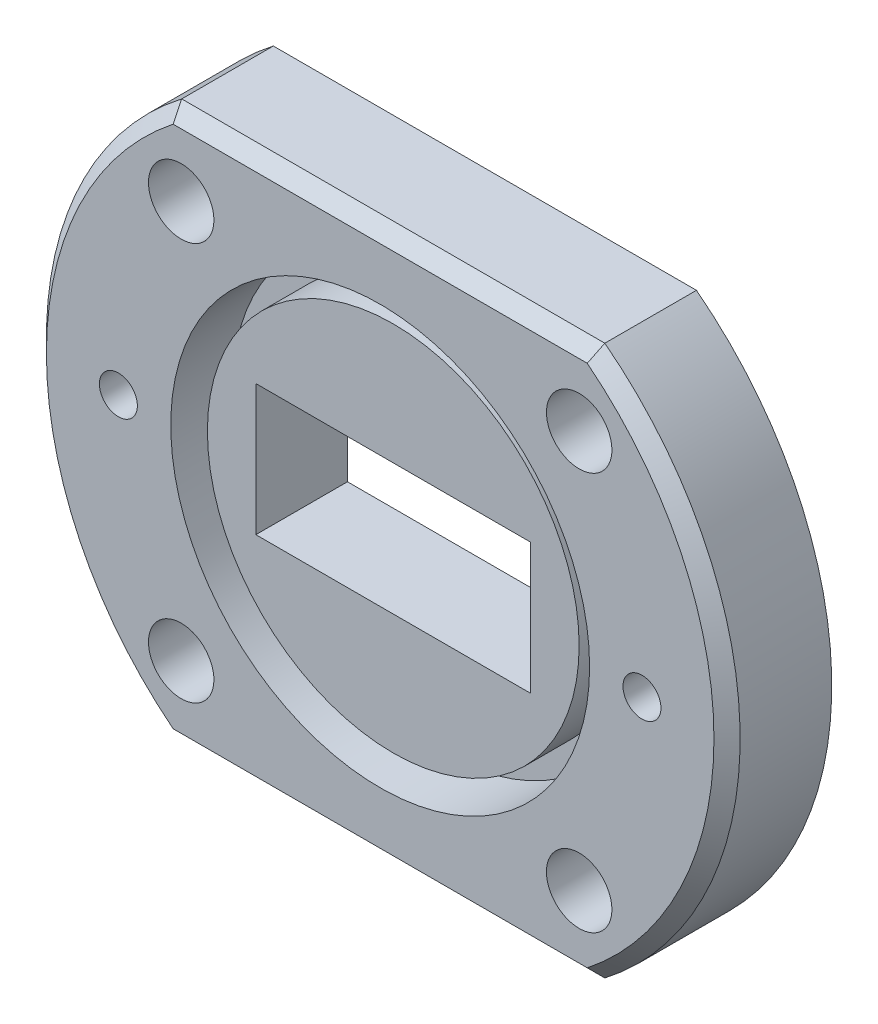
ISO-10303-21;
HEADER;
FILE_DESCRIPTION(('STEP AP214'),'2;1');
FILE_NAME('part.step','',(''),(''),'','','');
FILE_SCHEMA(('AUTOMOTIVE_DESIGN { 1 0 10303 214 1 1 1 1 }'));
ENDSEC;
DATA;
#1=APPLICATION_CONTEXT('core data for automotive mechanical design processes');
#2=APPLICATION_PROTOCOL_DEFINITION('international standard','automotive_design',2000,#1);
#3=PRODUCT_CONTEXT('',#1,'mechanical');
#4=PRODUCT('Part','Part','',(#3));
#5=PRODUCT_RELATED_PRODUCT_CATEGORY('part','',(#4));
#6=PRODUCT_DEFINITION_FORMATION('','',#4);
#7=PRODUCT_DEFINITION_CONTEXT('part definition',#1,'design');
#8=PRODUCT_DEFINITION('design','',#6,#7);
#9=PRODUCT_DEFINITION_SHAPE('','',#8);
#10=(LENGTH_UNIT() NAMED_UNIT(*) SI_UNIT(.MILLI.,.METRE.));
#11=(NAMED_UNIT(*) PLANE_ANGLE_UNIT() SI_UNIT($,.RADIAN.));
#12=(NAMED_UNIT(*) SI_UNIT($,.STERADIAN.) SOLID_ANGLE_UNIT());
#13=UNCERTAINTY_MEASURE_WITH_UNIT(LENGTH_MEASURE(1.E-05),#10,'distance_accuracy_value','');
#14=(GEOMETRIC_REPRESENTATION_CONTEXT(3) GLOBAL_UNCERTAINTY_ASSIGNED_CONTEXT((#13)) GLOBAL_UNIT_ASSIGNED_CONTEXT((#10,
#11,#12)) REPRESENTATION_CONTEXT('',''));
#15=CARTESIAN_POINT('',(0.,0.,0.));
#16=DIRECTION('',(0.,0.,1.));
#17=DIRECTION('',(1.,0.,0.));
#18=AXIS2_PLACEMENT_3D('',#15,#16,#17);
#19=CARTESIAN_POINT('',(0.,0.,8.));
#20=DIRECTION('',(0.,0.,-1.));
#21=DIRECTION('',(-1.,0.,0.));
#22=AXIS2_PLACEMENT_3D('',#19,#20,#21);
#23=CYLINDRICAL_SURFACE('',#22,26.5);
#24=CARTESIAN_POINT('',(0.,0.,7.00000000000001));
#25=DIRECTION('',(0.,0.,1.));
#26=DIRECTION('',(1.,0.,0.));
#27=AXIS2_PLACEMENT_3D('',#24,#25,#26);
#28=CIRCLE('',#27,26.5);
#29=CARTESIAN_POINT('',(16.1632298752446,21.,7.00000000000001));
#30=VERTEX_POINT('',#29);
#31=CARTESIAN_POINT('',(16.1632298752446,-21.,7.00000000000001));
#32=VERTEX_POINT('',#31);
#33=EDGE_CURVE('E148',#30,#32,#28,.F.);
#34=ORIENTED_EDGE('',*,*,#33,.T.);
#35=DIRECTION('',(0.,0.,-1.));
#36=VECTOR('',#35,1.);
#37=CARTESIAN_POINT('',(16.1632298752446,-21.,8.));
#38=LINE('',#37,#36);
#39=CARTESIAN_POINT('',(16.1632298752446,-21.,0.));
#40=VERTEX_POINT('',#39);
#41=EDGE_CURVE('E146',#32,#40,#38,.T.);
#42=ORIENTED_EDGE('',*,*,#41,.T.);
#43=CARTESIAN_POINT('',(0.,0.,0.));
#44=DIRECTION('',(0.,0.,1.));
#45=DIRECTION('',(1.,0.,0.));
#46=AXIS2_PLACEMENT_3D('',#43,#44,#45);
#47=CIRCLE('',#46,26.5);
#48=CARTESIAN_POINT('',(16.1632298752446,21.,0.));
#49=VERTEX_POINT('',#48);
#50=EDGE_CURVE('E210',#40,#49,#47,.T.);
#51=ORIENTED_EDGE('',*,*,#50,.T.);
#52=DIRECTION('',(0.,0.,-1.));
#53=VECTOR('',#52,1.);
#54=CARTESIAN_POINT('',(16.1632298752446,21.,8.));
#55=LINE('',#54,#53);
#56=EDGE_CURVE('E205',#49,#30,#55,.F.);
#57=ORIENTED_EDGE('',*,*,#56,.T.);
#58=EDGE_LOOP('',(#34,#42,#51,#57));
#59=FACE_BOUND('',#58,.T.);
#60=ADVANCED_FACE('F50',(#59),#23,.T.);
#61=CARTESIAN_POINT('',(0.,0.,8.));
#62=DIRECTION('',(0.,0.,-1.));
#63=DIRECTION('',(-1.,0.,0.));
#64=AXIS2_PLACEMENT_3D('',#61,#62,#63);
#65=CONICAL_SURFACE('',#64,25.5,0.785398163397447);
#66=CARTESIAN_POINT('',(0.,0.,8.));
#67=DIRECTION('',(0.,0.,1.));
#68=DIRECTION('',(1.,0.,0.));
#69=AXIS2_PLACEMENT_3D('',#66,#67,#68);
#70=CIRCLE('',#69,25.5);
#71=CARTESIAN_POINT('',(15.8192920195564,-20.,8.));
#72=VERTEX_POINT('',#71);
#73=CARTESIAN_POINT('',(15.8192920195564,20.,8.));
#74=VERTEX_POINT('',#73);
#75=EDGE_CURVE('E166',#72,#74,#70,.T.);
#76=ORIENTED_EDGE('',*,*,#75,.F.);
#77=CARTESIAN_POINT('',(15.8192920195564,-20.,8.));
#78=CARTESIAN_POINT('',(15.8771970048923,-20.166566584311,7.83343341568894));
#79=CARTESIAN_POINT('',(15.934810986366,-20.3331832122443,7.66681678775571));
#80=CARTESIAN_POINT('',(16.0494569382279,-20.6665165455835,7.33348345441651));
#81=CARTESIAN_POINT('',(16.1064889086503,-20.8332332509836,7.16676674901641));
#82=CARTESIAN_POINT('',(16.1632298752446,-21.,7.));
#83=B_SPLINE_CURVE_WITH_KNOTS('',3,(#77,#78,#79,#80,#81,#82),.UNSPECIFIED.,.F.,.F.,(4,2,4),(0.,
0.727718455462264,1.45543686825852),.UNSPECIFIED.);
#84=EDGE_CURVE('E59',#72,#32,#83,.T.);
#85=ORIENTED_EDGE('',*,*,#84,.T.);
#86=ORIENTED_EDGE('',*,*,#33,.F.);
#87=CARTESIAN_POINT('',(16.1632298752446,21.,7.));
#88=CARTESIAN_POINT('',(16.1064889086503,20.8332332509836,7.16676674901641));
#89=CARTESIAN_POINT('',(16.0494569382279,20.6665165455835,7.33348345441651));
#90=CARTESIAN_POINT('',(15.934810986366,20.3331832122443,7.66681678775571));
#91=CARTESIAN_POINT('',(15.8771970048923,20.166566584311,7.83343341568895));
#92=CARTESIAN_POINT('',(15.8192920195564,20.,8.));
#93=B_SPLINE_CURVE_WITH_KNOTS('',3,(#87,#88,#89,#90,#91,#92),.UNSPECIFIED.,.F.,.F.,(4,2,4),(0.,
0.727718412796261,1.45543686825852),.UNSPECIFIED.);
#94=EDGE_CURVE('E66',#30,#74,#93,.T.);
#95=ORIENTED_EDGE('',*,*,#94,.T.);
#96=EDGE_LOOP('',(#76,#85,#86,#95));
#97=FACE_BOUND('',#96,.T.);
#98=ADVANCED_FACE('F183',(#97),#65,.T.);
#99=CARTESIAN_POINT('',(-16.1632298752446,21.,0.));
#100=VERTEX_POINT('',#99);
#101=CARTESIAN_POINT('',(-16.1632298752446,-21.,0.));
#102=VERTEX_POINT('',#101);
#103=EDGE_CURVE('E158',#100,#102,#47,.T.);
#104=ORIENTED_EDGE('',*,*,#103,.T.);
#105=DIRECTION('',(0.,0.,-1.));
#106=VECTOR('',#105,1.);
#107=CARTESIAN_POINT('',(-16.1632298752446,-21.,8.));
#108=LINE('',#107,#106);
#109=CARTESIAN_POINT('',(-16.1632298752446,-21.,7.00000000000001));
#110=VERTEX_POINT('',#109);
#111=EDGE_CURVE('E143',#102,#110,#108,.F.);
#112=ORIENTED_EDGE('',*,*,#111,.T.);
#113=CARTESIAN_POINT('',(-16.1632298752446,21.,7.00000000000001));
#114=VERTEX_POINT('',#113);
#115=EDGE_CURVE('E155',#110,#114,#28,.F.);
#116=ORIENTED_EDGE('',*,*,#115,.T.);
#117=DIRECTION('',(0.,0.,-1.));
#118=VECTOR('',#117,1.);
#119=CARTESIAN_POINT('',(-16.1632298752446,21.,8.));
#120=LINE('',#119,#118);
#121=EDGE_CURVE('E207',#114,#100,#120,.T.);
#122=ORIENTED_EDGE('',*,*,#121,.T.);
#123=EDGE_LOOP('',(#104,#112,#116,#122));
#124=FACE_BOUND('',#123,.T.);
#125=ADVANCED_FACE('F153',(#124),#23,.T.);
#126=CARTESIAN_POINT('',(0.,0.,8.));
#127=DIRECTION('',(0.,0.,1.));
#128=DIRECTION('',(1.,0.,0.));
#129=AXIS2_PLACEMENT_3D('',#126,#127,#128);
#130=PLANE('',#129);
#131=CARTESIAN_POINT('',(20.,0.,8.));
#132=DIRECTION('',(0.,0.,1.));
#133=DIRECTION('',(1.,0.,0.));
#134=AXIS2_PLACEMENT_3D('',#131,#132,#133);
#135=CIRCLE('',#134,1.44999999999999);
#136=CARTESIAN_POINT('',(21.45,0.,8.));
#137=VERTEX_POINT('',#136);
#138=EDGE_CURVE('E294',#137,#137,#135,.T.);
#139=ORIENTED_EDGE('',*,*,#138,.F.);
#140=EDGE_LOOP('',(#139));
#141=FACE_BOUND('',#140,.T.);
#142=CARTESIAN_POINT('',(-20.,0.,8.));
#143=DIRECTION('',(0.,0.,1.));
#144=DIRECTION('',(1.,0.,0.));
#145=AXIS2_PLACEMENT_3D('',#142,#143,#144);
#146=CIRCLE('',#145,1.44999999999999);
#147=CARTESIAN_POINT('',(-18.55,0.,8.));
#148=VERTEX_POINT('',#147);
#149=EDGE_CURVE('E288',#148,#148,#146,.T.);
#150=ORIENTED_EDGE('',*,*,#149,.F.);
#151=EDGE_LOOP('',(#150));
#152=FACE_BOUND('',#151,.T.);
#153=CARTESIAN_POINT('',(-15.8192920195564,20.,8.));
#154=VERTEX_POINT('',#153);
#155=CARTESIAN_POINT('',(-15.8192920195564,-20.,8.));
#156=VERTEX_POINT('',#155);
#157=EDGE_CURVE('E164',#154,#156,#70,.T.);
#158=ORIENTED_EDGE('',*,*,#157,.T.);
#159=DIRECTION('',(1.,0.,0.));
#160=VECTOR('',#159,1.);
#161=CARTESIAN_POINT('',(14.4654761414895,-20.,8.));
#162=LINE('',#161,#160);
#163=EDGE_CURVE('E73',#156,#72,#162,.T.);
#164=ORIENTED_EDGE('',*,*,#163,.T.);
#165=ORIENTED_EDGE('',*,*,#75,.T.);
#166=DIRECTION('',(-1.,0.,0.));
#167=VECTOR('',#166,1.);
#168=CARTESIAN_POINT('',(-14.4654761414895,20.,8.));
#169=LINE('',#168,#167);
#170=EDGE_CURVE('E136',#74,#154,#169,.T.);
#171=ORIENTED_EDGE('',*,*,#170,.T.);
#172=EDGE_LOOP('',(#158,#164,#165,#171));
#173=FACE_BOUND('',#172,.T.);
#174=CARTESIAN_POINT('',(-15.2027957955108,-15.2027957955107,8.));
#175=DIRECTION('',(0.,0.,1.));
#176=DIRECTION('',(0.,1.,0.));
#177=AXIS2_PLACEMENT_3D('',#174,#175,#176);
#178=CIRCLE('',#177,2.5);
#179=CARTESIAN_POINT('',(-15.2027957955108,-12.7027957955107,8.));
#180=VERTEX_POINT('',#179);
#181=EDGE_CURVE('E277',#180,#180,#178,.T.);
#182=ORIENTED_EDGE('',*,*,#181,.F.);
#183=EDGE_LOOP('',(#182));
#184=FACE_BOUND('',#183,.T.);
#185=CARTESIAN_POINT('',(15.2027957955109,-15.2027957955107,8.));
#186=DIRECTION('',(0.,0.,1.));
#187=DIRECTION('',(-1.,0.,0.));
#188=AXIS2_PLACEMENT_3D('',#185,#186,#187);
#189=CIRCLE('',#188,2.5);
#190=CARTESIAN_POINT('',(12.7027957955109,-15.2027957955107,8.));
#191=VERTEX_POINT('',#190);
#192=EDGE_CURVE('E271',#191,#191,#189,.T.);
#193=ORIENTED_EDGE('',*,*,#192,.F.);
#194=EDGE_LOOP('',(#193));
#195=FACE_BOUND('',#194,.T.);
#196=CARTESIAN_POINT('',(15.2027957955107,15.2027957955108,8.));
#197=DIRECTION('',(0.,0.,1.));
#198=DIRECTION('',(0.,-1.,0.));
#199=AXIS2_PLACEMENT_3D('',#196,#197,#198);
#200=CIRCLE('',#199,2.5);
#201=CARTESIAN_POINT('',(15.2027957955107,12.7027957955108,8.));
#202=VERTEX_POINT('',#201);
#203=EDGE_CURVE('E265',#202,#202,#200,.T.);
#204=ORIENTED_EDGE('',*,*,#203,.F.);
#205=EDGE_LOOP('',(#204));
#206=FACE_BOUND('',#205,.T.);
#207=CARTESIAN_POINT('',(-15.2027957955109,15.2027957955107,8.));
#208=DIRECTION('',(0.,0.,1.));
#209=DIRECTION('',(1.,0.,0.));
#210=AXIS2_PLACEMENT_3D('',#207,#208,#209);
#211=CIRCLE('',#210,2.5);
#212=CARTESIAN_POINT('',(-12.7027957955109,15.2027957955107,8.));
#213=VERTEX_POINT('',#212);
#214=EDGE_CURVE('E259',#213,#213,#211,.T.);
#215=ORIENTED_EDGE('',*,*,#214,.F.);
#216=EDGE_LOOP('',(#215));
#217=FACE_BOUND('',#216,.T.);
#218=CARTESIAN_POINT('',(0.,0.,8.));
#219=DIRECTION('',(0.,0.,1.));
#220=DIRECTION('',(1.,0.,0.));
#221=AXIS2_PLACEMENT_3D('',#218,#219,#220);
#222=CIRCLE('',#221,16.);
#223=CARTESIAN_POINT('',(16.,0.,8.));
#224=VERTEX_POINT('',#223);
#225=EDGE_CURVE('E213',#224,#224,#222,.T.);
#226=ORIENTED_EDGE('',*,*,#225,.F.);
#227=EDGE_LOOP('',(#226));
#228=FACE_BOUND('',#227,.T.);
#229=ADVANCED_FACE('F198',(#141,#152,#173,#184,#195,#206,#217,#228),#130,.T.);
#230=CARTESIAN_POINT('',(0.,0.,0.));
#231=DIRECTION('',(0.,0.,1.));
#232=DIRECTION('',(1.,0.,0.));
#233=AXIS2_PLACEMENT_3D('',#230,#231,#232);
#234=PLANE('',#233);
#235=CARTESIAN_POINT('',(20.,0.,0.));
#236=DIRECTION('',(0.,0.,1.));
#237=DIRECTION('',(1.,0.,0.));
#238=AXIS2_PLACEMENT_3D('',#235,#236,#237);
#239=CIRCLE('',#238,1.45);
#240=CARTESIAN_POINT('',(21.45,0.,0.));
#241=VERTEX_POINT('',#240);
#242=EDGE_CURVE('E291',#241,#241,#239,.T.);
#243=ORIENTED_EDGE('',*,*,#242,.T.);
#244=EDGE_LOOP('',(#243));
#245=FACE_BOUND('',#244,.T.);
#246=CARTESIAN_POINT('',(-20.,0.,0.));
#247=DIRECTION('',(0.,0.,1.));
#248=DIRECTION('',(1.,0.,0.));
#249=AXIS2_PLACEMENT_3D('',#246,#247,#248);
#250=CIRCLE('',#249,1.45);
#251=CARTESIAN_POINT('',(-18.55,0.,0.));
#252=VERTEX_POINT('',#251);
#253=EDGE_CURVE('E160',#252,#252,#250,.T.);
#254=ORIENTED_EDGE('',*,*,#253,.T.);
#255=EDGE_LOOP('',(#254));
#256=FACE_BOUND('',#255,.T.);
#257=CARTESIAN_POINT('',(-15.2027957955108,-15.2027957955107,0.));
#258=DIRECTION('',(0.,0.,1.));
#259=DIRECTION('',(0.,1.,0.));
#260=AXIS2_PLACEMENT_3D('',#257,#258,#259);
#261=CIRCLE('',#260,2.5);
#262=CARTESIAN_POINT('',(-15.2027957955108,-12.7027957955107,0.));
#263=VERTEX_POINT('',#262);
#264=EDGE_CURVE('E274',#263,#263,#261,.T.);
#265=ORIENTED_EDGE('',*,*,#264,.T.);
#266=EDGE_LOOP('',(#265));
#267=FACE_BOUND('',#266,.T.);
#268=CARTESIAN_POINT('',(15.2027957955109,-15.2027957955107,0.));
#269=DIRECTION('',(0.,0.,1.));
#270=DIRECTION('',(-1.,0.,0.));
#271=AXIS2_PLACEMENT_3D('',#268,#269,#270);
#272=CIRCLE('',#271,2.5);
#273=CARTESIAN_POINT('',(12.7027957955109,-15.2027957955107,0.));
#274=VERTEX_POINT('',#273);
#275=EDGE_CURVE('E268',#274,#274,#272,.T.);
#276=ORIENTED_EDGE('',*,*,#275,.T.);
#277=EDGE_LOOP('',(#276));
#278=FACE_BOUND('',#277,.T.);
#279=CARTESIAN_POINT('',(15.2027957955107,15.2027957955108,0.));
#280=DIRECTION('',(0.,0.,1.));
#281=DIRECTION('',(0.,-1.,0.));
#282=AXIS2_PLACEMENT_3D('',#279,#280,#281);
#283=CIRCLE('',#282,2.5);
#284=CARTESIAN_POINT('',(15.2027957955107,12.7027957955108,0.));
#285=VERTEX_POINT('',#284);
#286=EDGE_CURVE('E262',#285,#285,#283,.T.);
#287=ORIENTED_EDGE('',*,*,#286,.T.);
#288=EDGE_LOOP('',(#287));
#289=FACE_BOUND('',#288,.T.);
#290=CARTESIAN_POINT('',(-15.2027957955109,15.2027957955107,0.));
#291=DIRECTION('',(0.,0.,1.));
#292=DIRECTION('',(1.,0.,0.));
#293=AXIS2_PLACEMENT_3D('',#290,#291,#292);
#294=CIRCLE('',#293,2.5);
#295=CARTESIAN_POINT('',(-12.7027957955109,15.2027957955107,0.));
#296=VERTEX_POINT('',#295);
#297=EDGE_CURVE('E248',#296,#296,#294,.T.);
#298=ORIENTED_EDGE('',*,*,#297,.T.);
#299=EDGE_LOOP('',(#298));
#300=FACE_BOUND('',#299,.T.);
#301=DIRECTION('',(1.,0.,0.));
#302=VECTOR('',#301,1.);
#303=CARTESIAN_POINT('',(-10.5,-5.,0.));
#304=LINE('',#303,#302);
#305=CARTESIAN_POINT('',(-10.5,-5.,0.));
#306=VERTEX_POINT('',#305);
#307=CARTESIAN_POINT('',(10.5,-5.,0.));
#308=VERTEX_POINT('',#307);
#309=EDGE_CURVE('E231',#306,#308,#304,.T.);
#310=ORIENTED_EDGE('',*,*,#309,.T.);
#311=DIRECTION('',(0.,1.,0.));
#312=VECTOR('',#311,1.);
#313=CARTESIAN_POINT('',(10.5,-5.,0.));
#314=LINE('',#313,#312);
#315=CARTESIAN_POINT('',(10.5,5.,0.));
#316=VERTEX_POINT('',#315);
#317=EDGE_CURVE('E239',#308,#316,#314,.T.);
#318=ORIENTED_EDGE('',*,*,#317,.T.);
#319=DIRECTION('',(-1.,0.,0.));
#320=VECTOR('',#319,1.);
#321=CARTESIAN_POINT('',(-10.5,5.,0.));
#322=LINE('',#321,#320);
#323=CARTESIAN_POINT('',(-10.5,5.,0.));
#324=VERTEX_POINT('',#323);
#325=EDGE_CURVE('E254',#316,#324,#322,.T.);
#326=ORIENTED_EDGE('',*,*,#325,.T.);
#327=DIRECTION('',(0.,-1.,0.));
#328=VECTOR('',#327,1.);
#329=CARTESIAN_POINT('',(-10.5,-5.,0.));
#330=LINE('',#329,#328);
#331=EDGE_CURVE('E251',#324,#306,#330,.T.);
#332=ORIENTED_EDGE('',*,*,#331,.T.);
#333=EDGE_LOOP('',(#310,#318,#326,#332));
#334=FACE_BOUND('',#333,.T.);
#335=ORIENTED_EDGE('',*,*,#50,.F.);
#336=DIRECTION('',(-1.,0.,0.));
#337=VECTOR('',#336,1.);
#338=CARTESIAN_POINT('',(0.,-21.,0.));
#339=LINE('',#338,#337);
#340=EDGE_CURVE('E159',#40,#102,#339,.T.);
#341=ORIENTED_EDGE('',*,*,#340,.T.);
#342=ORIENTED_EDGE('',*,*,#103,.F.);
#343=DIRECTION('',(1.,0.,0.));
#344=VECTOR('',#343,1.);
#345=CARTESIAN_POINT('',(0.,21.,0.));
#346=LINE('',#345,#344);
#347=EDGE_CURVE('E211',#100,#49,#346,.T.);
#348=ORIENTED_EDGE('',*,*,#347,.T.);
#349=EDGE_LOOP('',(#335,#341,#342,#348));
#350=FACE_BOUND('',#349,.T.);
#351=ADVANCED_FACE('F302',(#245,#256,#267,#278,#289,#300,#334,#350),#234,.F.);
#352=CARTESIAN_POINT('',(0.,0.,7.));
#353=DIRECTION('',(0.,0.,1.));
#354=DIRECTION('',(1.,0.,0.));
#355=AXIS2_PLACEMENT_3D('',#352,#353,#354);
#356=CYLINDRICAL_SURFACE('',#355,16.);
#357=ORIENTED_EDGE('',*,*,#225,.T.);
#358=EDGE_LOOP('',(#357));
#359=FACE_BOUND('',#358,.T.);
#360=CARTESIAN_POINT('',(0.,0.,3.3));
#361=DIRECTION('',(0.,0.,1.));
#362=DIRECTION('',(1.,0.,0.));
#363=AXIS2_PLACEMENT_3D('',#360,#361,#362);
#364=CIRCLE('',#363,16.);
#365=CARTESIAN_POINT('',(16.,0.,3.3));
#366=VERTEX_POINT('',#365);
#367=EDGE_CURVE('E217',#366,#366,#364,.T.);
#368=ORIENTED_EDGE('',*,*,#367,.F.);
#369=EDGE_LOOP('',(#368));
#370=FACE_BOUND('',#369,.T.);
#371=ADVANCED_FACE('F338',(#359,#370),#356,.F.);
#372=CARTESIAN_POINT('',(0.,0.,3.3));
#373=DIRECTION('',(0.,0.,1.));
#374=DIRECTION('',(1.,0.,0.));
#375=AXIS2_PLACEMENT_3D('',#372,#373,#374);
#376=PLANE('',#375);
#377=CARTESIAN_POINT('',(0.,0.,3.3));
#378=DIRECTION('',(0.,0.,1.));
#379=DIRECTION('',(1.,0.,0.));
#380=AXIS2_PLACEMENT_3D('',#377,#378,#379);
#381=CIRCLE('',#380,14.2);
#382=CARTESIAN_POINT('',(14.2,0.,3.3));
#383=VERTEX_POINT('',#382);
#384=EDGE_CURVE('E220',#383,#383,#381,.T.);
#385=ORIENTED_EDGE('',*,*,#384,.F.);
#386=EDGE_LOOP('',(#385));
#387=FACE_BOUND('',#386,.T.);
#388=ORIENTED_EDGE('',*,*,#367,.T.);
#389=EDGE_LOOP('',(#388));
#390=FACE_BOUND('',#389,.T.);
#391=ADVANCED_FACE('F347',(#387,#390),#376,.T.);
#392=CARTESIAN_POINT('',(0.,0.,3.3));
#393=DIRECTION('',(0.,0.,1.));
#394=DIRECTION('',(1.,0.,0.));
#395=AXIS2_PLACEMENT_3D('',#392,#393,#394);
#396=CYLINDRICAL_SURFACE('',#395,14.2);
#397=ORIENTED_EDGE('',*,*,#384,.T.);
#398=EDGE_LOOP('',(#397));
#399=FACE_BOUND('',#398,.T.);
#400=CARTESIAN_POINT('',(0.,0.,7.));
#401=DIRECTION('',(0.,0.,1.));
#402=DIRECTION('',(1.,0.,0.));
#403=AXIS2_PLACEMENT_3D('',#400,#401,#402);
#404=CIRCLE('',#403,14.2);
#405=CARTESIAN_POINT('',(14.2,0.,7.));
#406=VERTEX_POINT('',#405);
#407=EDGE_CURVE('E221',#406,#406,#404,.T.);
#408=ORIENTED_EDGE('',*,*,#407,.F.);
#409=EDGE_LOOP('',(#408));
#410=FACE_BOUND('',#409,.T.);
#411=ADVANCED_FACE('F355',(#399,#410),#396,.T.);
#412=CARTESIAN_POINT('',(0.,0.,7.));
#413=DIRECTION('',(0.,0.,1.));
#414=DIRECTION('',(1.,0.,0.));
#415=AXIS2_PLACEMENT_3D('',#412,#413,#414);
#416=PLANE('',#415);
#417=DIRECTION('',(0.,1.,0.));
#418=VECTOR('',#417,1.);
#419=CARTESIAN_POINT('',(10.5,-5.,7.));
#420=LINE('',#419,#418);
#421=CARTESIAN_POINT('',(10.5,-5.,7.));
#422=VERTEX_POINT('',#421);
#423=CARTESIAN_POINT('',(10.5,5.,7.));
#424=VERTEX_POINT('',#423);
#425=EDGE_CURVE('E246',#422,#424,#420,.T.);
#426=ORIENTED_EDGE('',*,*,#425,.F.);
#427=DIRECTION('',(1.,0.,0.));
#428=VECTOR('',#427,1.);
#429=CARTESIAN_POINT('',(-10.5,-5.,7.));
#430=LINE('',#429,#428);
#431=CARTESIAN_POINT('',(-10.5,-5.,7.));
#432=VERTEX_POINT('',#431);
#433=EDGE_CURVE('E236',#432,#422,#430,.T.);
#434=ORIENTED_EDGE('',*,*,#433,.F.);
#435=DIRECTION('',(0.,-1.,0.));
#436=VECTOR('',#435,1.);
#437=CARTESIAN_POINT('',(-10.5,-5.,7.));
#438=LINE('',#437,#436);
#439=CARTESIAN_POINT('',(-10.5,5.,7.));
#440=VERTEX_POINT('',#439);
#441=EDGE_CURVE('E240',#440,#432,#438,.T.);
#442=ORIENTED_EDGE('',*,*,#441,.F.);
#443=DIRECTION('',(-1.,0.,0.));
#444=VECTOR('',#443,1.);
#445=CARTESIAN_POINT('',(-10.5,5.,7.));
#446=LINE('',#445,#444);
#447=EDGE_CURVE('E243',#424,#440,#446,.T.);
#448=ORIENTED_EDGE('',*,*,#447,.F.);
#449=EDGE_LOOP('',(#426,#434,#442,#448));
#450=FACE_BOUND('',#449,.T.);
#451=ORIENTED_EDGE('',*,*,#407,.T.);
#452=EDGE_LOOP('',(#451));
#453=FACE_BOUND('',#452,.T.);
#454=ADVANCED_FACE('F363',(#450,#453),#416,.T.);
#455=CARTESIAN_POINT('',(10.5,-5.,0.));
#456=DIRECTION('',(1.,0.,0.));
#457=DIRECTION('',(0.,0.,-1.));
#458=AXIS2_PLACEMENT_3D('',#455,#456,#457);
#459=PLANE('',#458);
#460=ORIENTED_EDGE('',*,*,#425,.T.);
#461=DIRECTION('',(0.,0.,1.));
#462=VECTOR('',#461,1.);
#463=CARTESIAN_POINT('',(10.5,5.,0.));
#464=LINE('',#463,#462);
#465=EDGE_CURVE('E227',#316,#424,#464,.T.);
#466=ORIENTED_EDGE('',*,*,#465,.F.);
#467=ORIENTED_EDGE('',*,*,#317,.F.);
#468=DIRECTION('',(0.,0.,1.));
#469=VECTOR('',#468,1.);
#470=CARTESIAN_POINT('',(10.5,-5.,0.));
#471=LINE('',#470,#469);
#472=EDGE_CURVE('E224',#308,#422,#471,.T.);
#473=ORIENTED_EDGE('',*,*,#472,.T.);
#474=EDGE_LOOP('',(#460,#466,#467,#473));
#475=FACE_BOUND('',#474,.T.);
#476=ADVANCED_FACE('F371',(#475),#459,.F.);
#477=CARTESIAN_POINT('',(-10.5,-5.,0.));
#478=DIRECTION('',(0.,-1.,0.));
#479=DIRECTION('',(0.,0.,-1.));
#480=AXIS2_PLACEMENT_3D('',#477,#478,#479);
#481=PLANE('',#480);
#482=ORIENTED_EDGE('',*,*,#433,.T.);
#483=ORIENTED_EDGE('',*,*,#472,.F.);
#484=ORIENTED_EDGE('',*,*,#309,.F.);
#485=DIRECTION('',(0.,0.,1.));
#486=VECTOR('',#485,1.);
#487=CARTESIAN_POINT('',(-10.5,-5.,0.));
#488=LINE('',#487,#486);
#489=EDGE_CURVE('E233',#306,#432,#488,.T.);
#490=ORIENTED_EDGE('',*,*,#489,.T.);
#491=EDGE_LOOP('',(#482,#483,#484,#490));
#492=FACE_BOUND('',#491,.T.);
#493=ADVANCED_FACE('F379',(#492),#481,.F.);
#494=CARTESIAN_POINT('',(-10.5,-5.,0.));
#495=DIRECTION('',(-1.,0.,0.));
#496=DIRECTION('',(0.,0.,1.));
#497=AXIS2_PLACEMENT_3D('',#494,#495,#496);
#498=PLANE('',#497);
#499=ORIENTED_EDGE('',*,*,#441,.T.);
#500=ORIENTED_EDGE('',*,*,#489,.F.);
#501=ORIENTED_EDGE('',*,*,#331,.F.);
#502=DIRECTION('',(0.,0.,1.));
#503=VECTOR('',#502,1.);
#504=CARTESIAN_POINT('',(-10.5,5.,0.));
#505=LINE('',#504,#503);
#506=EDGE_CURVE('E230',#324,#440,#505,.T.);
#507=ORIENTED_EDGE('',*,*,#506,.T.);
#508=EDGE_LOOP('',(#499,#500,#501,#507));
#509=FACE_BOUND('',#508,.T.);
#510=ADVANCED_FACE('F387',(#509),#498,.F.);
#511=CARTESIAN_POINT('',(-10.5,5.,0.));
#512=DIRECTION('',(0.,1.,0.));
#513=DIRECTION('',(0.,0.,1.));
#514=AXIS2_PLACEMENT_3D('',#511,#512,#513);
#515=PLANE('',#514);
#516=ORIENTED_EDGE('',*,*,#447,.T.);
#517=ORIENTED_EDGE('',*,*,#506,.F.);
#518=ORIENTED_EDGE('',*,*,#325,.F.);
#519=ORIENTED_EDGE('',*,*,#465,.T.);
#520=EDGE_LOOP('',(#516,#517,#518,#519));
#521=FACE_BOUND('',#520,.T.);
#522=ADVANCED_FACE('F395',(#521),#515,.F.);
#523=CARTESIAN_POINT('',(-15.2027957955109,15.2027957955107,0.));
#524=DIRECTION('',(0.,0.,1.));
#525=DIRECTION('',(1.,0.,0.));
#526=AXIS2_PLACEMENT_3D('',#523,#524,#525);
#527=CYLINDRICAL_SURFACE('',#526,2.5);
#528=ORIENTED_EDGE('',*,*,#297,.F.);
#529=EDGE_LOOP('',(#528));
#530=FACE_BOUND('',#529,.T.);
#531=ORIENTED_EDGE('',*,*,#214,.T.);
#532=EDGE_LOOP('',(#531));
#533=FACE_BOUND('',#532,.T.);
#534=ADVANCED_FACE('F403',(#530,#533),#527,.F.);
#535=CARTESIAN_POINT('',(15.2027957955107,15.2027957955108,0.));
#536=DIRECTION('',(0.,0.,1.));
#537=DIRECTION('',(1.,0.,0.));
#538=AXIS2_PLACEMENT_3D('',#535,#536,#537);
#539=CYLINDRICAL_SURFACE('',#538,2.5);
#540=ORIENTED_EDGE('',*,*,#286,.F.);
#541=EDGE_LOOP('',(#540));
#542=FACE_BOUND('',#541,.T.);
#543=ORIENTED_EDGE('',*,*,#203,.T.);
#544=EDGE_LOOP('',(#543));
#545=FACE_BOUND('',#544,.T.);
#546=ADVANCED_FACE('F411',(#542,#545),#539,.F.);
#547=CARTESIAN_POINT('',(15.2027957955109,-15.2027957955107,0.));
#548=DIRECTION('',(0.,0.,1.));
#549=DIRECTION('',(1.,0.,0.));
#550=AXIS2_PLACEMENT_3D('',#547,#548,#549);
#551=CYLINDRICAL_SURFACE('',#550,2.5);
#552=ORIENTED_EDGE('',*,*,#275,.F.);
#553=EDGE_LOOP('',(#552));
#554=FACE_BOUND('',#553,.T.);
#555=ORIENTED_EDGE('',*,*,#192,.T.);
#556=EDGE_LOOP('',(#555));
#557=FACE_BOUND('',#556,.T.);
#558=ADVANCED_FACE('F419',(#554,#557),#551,.F.);
#559=CARTESIAN_POINT('',(-15.2027957955108,-15.2027957955107,0.));
#560=DIRECTION('',(0.,0.,1.));
#561=DIRECTION('',(1.,0.,0.));
#562=AXIS2_PLACEMENT_3D('',#559,#560,#561);
#563=CYLINDRICAL_SURFACE('',#562,2.5);
#564=ORIENTED_EDGE('',*,*,#264,.F.);
#565=EDGE_LOOP('',(#564));
#566=FACE_BOUND('',#565,.T.);
#567=ORIENTED_EDGE('',*,*,#181,.T.);
#568=EDGE_LOOP('',(#567));
#569=FACE_BOUND('',#568,.T.);
#570=ADVANCED_FACE('F182',(#566,#569),#563,.F.);
#571=ORIENTED_EDGE('',*,*,#115,.F.);
#572=CARTESIAN_POINT('',(-16.1632298752446,-21.,7.));
#573=CARTESIAN_POINT('',(-16.1064889086503,-20.8332332509836,7.16676674901641));
#574=CARTESIAN_POINT('',(-16.0494569382279,-20.6665165455835,7.33348345441651));
#575=CARTESIAN_POINT('',(-15.934810986366,-20.3331832122443,7.66681678775571));
#576=CARTESIAN_POINT('',(-15.8771970048923,-20.166566584311,7.83343341568895));
#577=CARTESIAN_POINT('',(-15.8192920195564,-20.,8.));
#578=B_SPLINE_CURVE_WITH_KNOTS('',3,(#572,#573,#574,#575,#576,#577),.UNSPECIFIED.,.F.,.F.,(4,2,
4),(0.,0.727718412796261,1.45543686825852),.UNSPECIFIED.);
#579=EDGE_CURVE('E128',#110,#156,#578,.T.);
#580=ORIENTED_EDGE('',*,*,#579,.T.);
#581=ORIENTED_EDGE('',*,*,#157,.F.);
#582=CARTESIAN_POINT('',(-15.8192920195564,20.,8.));
#583=CARTESIAN_POINT('',(-15.8771970048923,20.166566584311,7.83343341568894));
#584=CARTESIAN_POINT('',(-15.934810986366,20.3331832122443,7.66681678775571));
#585=CARTESIAN_POINT('',(-16.0494569382279,20.6665165455835,7.33348345441651));
#586=CARTESIAN_POINT('',(-16.1064889086503,20.8332332509836,7.16676674901641));
#587=CARTESIAN_POINT('',(-16.1632298752446,21.,7.));
#588=B_SPLINE_CURVE_WITH_KNOTS('',3,(#582,#583,#584,#585,#586,#587),.UNSPECIFIED.,.F.,.F.,(4,2,
4),(0.,0.727718455462264,1.45543686825852),.UNSPECIFIED.);
#589=EDGE_CURVE('E137',#154,#114,#588,.T.);
#590=ORIENTED_EDGE('',*,*,#589,.T.);
#591=EDGE_LOOP('',(#571,#580,#581,#590));
#592=FACE_BOUND('',#591,.T.);
#593=ADVANCED_FACE('F162',(#592),#65,.T.);
#594=CARTESIAN_POINT('',(0.,21.,0.));
#595=DIRECTION('',(0.,-1.,0.));
#596=DIRECTION('',(0.,0.,-1.));
#597=AXIS2_PLACEMENT_3D('',#594,#595,#596);
#598=PLANE('',#597);
#599=ORIENTED_EDGE('',*,*,#121,.F.);
#600=DIRECTION('',(1.,0.,0.));
#601=VECTOR('',#600,1.);
#602=CARTESIAN_POINT('',(14.4654761414895,21.,7.));
#603=LINE('',#602,#601);
#604=EDGE_CURVE('E13',#114,#30,#603,.T.);
#605=ORIENTED_EDGE('',*,*,#604,.T.);
#606=ORIENTED_EDGE('',*,*,#56,.F.);
#607=ORIENTED_EDGE('',*,*,#347,.F.);
#608=EDGE_LOOP('',(#599,#605,#606,#607));
#609=FACE_BOUND('',#608,.T.);
#610=ADVANCED_FACE('F181',(#609),#598,.F.);
#611=CARTESIAN_POINT('',(0.,-21.,0.));
#612=DIRECTION('',(0.,1.,0.));
#613=DIRECTION('',(0.,0.,-1.));
#614=AXIS2_PLACEMENT_3D('',#611,#612,#613);
#615=PLANE('',#614);
#616=ORIENTED_EDGE('',*,*,#41,.F.);
#617=DIRECTION('',(-1.,0.,0.));
#618=VECTOR('',#617,1.);
#619=CARTESIAN_POINT('',(-14.4654761414895,-21.,7.));
#620=LINE('',#619,#618);
#621=EDGE_CURVE('E132',#32,#110,#620,.T.);
#622=ORIENTED_EDGE('',*,*,#621,.T.);
#623=ORIENTED_EDGE('',*,*,#111,.F.);
#624=ORIENTED_EDGE('',*,*,#340,.F.);
#625=EDGE_LOOP('',(#616,#622,#623,#624));
#626=FACE_BOUND('',#625,.T.);
#627=ADVANCED_FACE('F142',(#626),#615,.F.);
#628=CARTESIAN_POINT('',(-20.,0.,8.));
#629=DIRECTION('',(0.,0.,1.));
#630=DIRECTION('',(1.,0.,0.));
#631=AXIS2_PLACEMENT_3D('',#628,#629,#630);
#632=CYLINDRICAL_SURFACE('',#631,1.44999999999999);
#633=ORIENTED_EDGE('',*,*,#253,.F.);
#634=EDGE_LOOP('',(#633));
#635=FACE_BOUND('',#634,.T.);
#636=ORIENTED_EDGE('',*,*,#149,.T.);
#637=EDGE_LOOP('',(#636));
#638=FACE_BOUND('',#637,.T.);
#639=ADVANCED_FACE('F306',(#635,#638),#632,.F.);
#640=CARTESIAN_POINT('',(20.,0.,8.));
#641=DIRECTION('',(0.,0.,1.));
#642=DIRECTION('',(1.,0.,0.));
#643=AXIS2_PLACEMENT_3D('',#640,#641,#642);
#644=CYLINDRICAL_SURFACE('',#643,1.44999999999999);
#645=ORIENTED_EDGE('',*,*,#242,.F.);
#646=EDGE_LOOP('',(#645));
#647=FACE_BOUND('',#646,.T.);
#648=ORIENTED_EDGE('',*,*,#138,.T.);
#649=EDGE_LOOP('',(#648));
#650=FACE_BOUND('',#649,.T.);
#651=ADVANCED_FACE('F298',(#647,#650),#644,.F.);
#652=CARTESIAN_POINT('',(0.,-21.,7.));
#653=DIRECTION('',(0.,-0.707106781186545,0.70710678118655));
#654=DIRECTION('',(1.,0.,0.));
#655=AXIS2_PLACEMENT_3D('',#652,#653,#654);
#656=PLANE('',#655);
#657=ORIENTED_EDGE('',*,*,#84,.F.);
#658=ORIENTED_EDGE('',*,*,#163,.F.);
#659=ORIENTED_EDGE('',*,*,#579,.F.);
#660=ORIENTED_EDGE('',*,*,#621,.F.);
#661=EDGE_LOOP('',(#657,#658,#659,#660));
#662=FACE_BOUND('',#661,.T.);
#663=ADVANCED_FACE('F131',(#662),#656,.T.);
#664=CARTESIAN_POINT('',(0.,21.,7.));
#665=DIRECTION('',(0.,0.707106781186545,0.70710678118655));
#666=DIRECTION('',(-1.,0.,0.));
#667=AXIS2_PLACEMENT_3D('',#664,#665,#666);
#668=PLANE('',#667);
#669=ORIENTED_EDGE('',*,*,#589,.F.);
#670=ORIENTED_EDGE('',*,*,#170,.F.);
#671=ORIENTED_EDGE('',*,*,#94,.F.);
#672=ORIENTED_EDGE('',*,*,#604,.F.);
#673=EDGE_LOOP('',(#669,#670,#671,#672));
#674=FACE_BOUND('',#673,.T.);
#675=ADVANCED_FACE('F52',(#674),#668,.T.);
#676=CLOSED_SHELL('',(#60,#98,#125,#229,#351,#371,#391,#411,#454,#476,#493,#510,#522,#534,#546,
#558,#570,#593,#610,#627,#639,#651,#663,#675));
#677=MANIFOLD_SOLID_BREP('B2',#676);
#678=ADVANCED_BREP_SHAPE_REPRESENTATION('',(#18,#677),#14);
#679=SHAPE_DEFINITION_REPRESENTATION(#9,#678);
ENDSEC;
END-ISO-10303-21;
